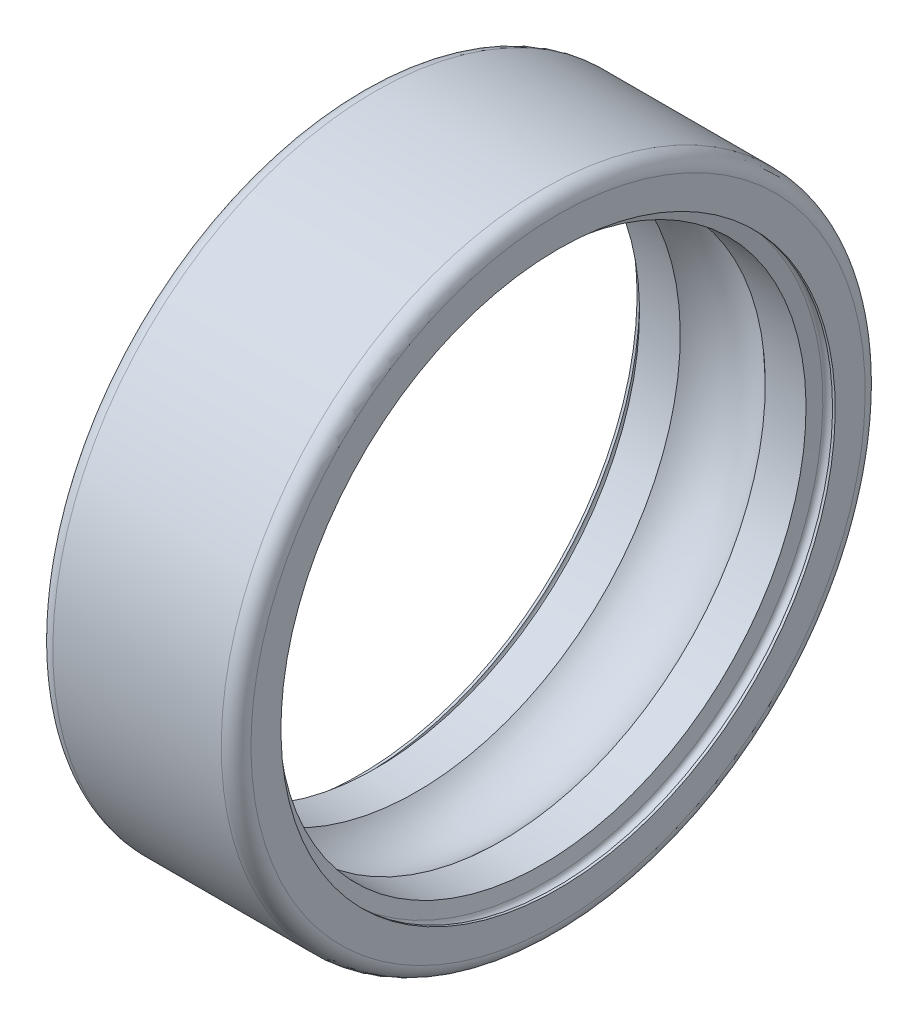
ISO-10303-21;
HEADER;
FILE_DESCRIPTION(('STEP AP214'),'2;1');
FILE_NAME('part.step','',(''),(''),'','','');
FILE_SCHEMA(('AUTOMOTIVE_DESIGN { 1 0 10303 214 1 1 1 1 }'));
ENDSEC;
DATA;
#1=APPLICATION_CONTEXT('core data for automotive mechanical design processes');
#2=APPLICATION_PROTOCOL_DEFINITION('international standard','automotive_design',2000,#1);
#3=PRODUCT_CONTEXT('',#1,'mechanical');
#4=PRODUCT('Part','Part','',(#3));
#5=PRODUCT_RELATED_PRODUCT_CATEGORY('part','',(#4));
#6=PRODUCT_DEFINITION_FORMATION('','',#4);
#7=PRODUCT_DEFINITION_CONTEXT('part definition',#1,'design');
#8=PRODUCT_DEFINITION('design','',#6,#7);
#9=PRODUCT_DEFINITION_SHAPE('','',#8);
#10=(LENGTH_UNIT() NAMED_UNIT(*) SI_UNIT(.MILLI.,.METRE.));
#11=(NAMED_UNIT(*) PLANE_ANGLE_UNIT() SI_UNIT($,.RADIAN.));
#12=(NAMED_UNIT(*) SI_UNIT($,.STERADIAN.) SOLID_ANGLE_UNIT());
#13=UNCERTAINTY_MEASURE_WITH_UNIT(LENGTH_MEASURE(1.E-05),#10,'distance_accuracy_value','');
#14=(GEOMETRIC_REPRESENTATION_CONTEXT(3) GLOBAL_UNCERTAINTY_ASSIGNED_CONTEXT((#13)) GLOBAL_UNIT_ASSIGNED_CONTEXT((#10,
#11,#12)) REPRESENTATION_CONTEXT('',''));
#15=CARTESIAN_POINT('',(0.,0.,0.));
#16=DIRECTION('',(0.,0.,1.));
#17=DIRECTION('',(1.,0.,0.));
#18=AXIS2_PLACEMENT_3D('',#15,#16,#17);
#19=CARTESIAN_POINT('',(7.676,0.,0.));
#20=DIRECTION('',(1.,0.,0.));
#21=DIRECTION('',(0.,0.,-1.));
#22=AXIS2_PLACEMENT_3D('',#19,#20,#21);
#23=TOROIDAL_SURFACE('',#22,11.19,0.216);
#24=CARTESIAN_POINT('',(7.892,0.,0.));
#25=DIRECTION('',(1.,0.,0.));
#26=DIRECTION('',(0.,1.,0.));
#27=AXIS2_PLACEMENT_3D('',#24,#25,#26);
#28=CIRCLE('',#27,11.19);
#29=CARTESIAN_POINT('',(7.892,11.19,0.));
#30=VERTEX_POINT('',#29);
#31=EDGE_CURVE('E11',#30,#30,#28,.T.);
#32=ORIENTED_EDGE('',*,*,#31,.T.);
#33=EDGE_LOOP('',(#32));
#34=FACE_BOUND('',#33,.T.);
#35=CARTESIAN_POINT('',(7.46328152534936,0.,0.));
#36=DIRECTION('',(1.,0.,0.));
#37=DIRECTION('',(0.,1.,0.));
#38=AXIS2_PLACEMENT_3D('',#35,#36,#37);
#39=CIRCLE('',#38,11.2275080063761);
#40=CARTESIAN_POINT('',(7.46328152534936,11.2275080063761,0.));
#41=VERTEX_POINT('',#40);
#42=EDGE_CURVE('E70',#41,#41,#39,.T.);
#43=ORIENTED_EDGE('',*,*,#42,.F.);
#44=EDGE_LOOP('',(#43));
#45=FACE_BOUND('',#44,.T.);
#46=ADVANCED_FACE('F16',(#34,#45),#23,.F.);
#47=CARTESIAN_POINT('',(7.946,0.,0.));
#48=DIRECTION('',(-1.,0.,0.));
#49=DIRECTION('',(0.,1.,0.));
#50=AXIS2_PLACEMENT_3D('',#47,#48,#49);
#51=CYLINDRICAL_SURFACE('',#50,11.19);
#52=CARTESIAN_POINT('',(8.,0.,0.));
#53=DIRECTION('',(1.,0.,0.));
#54=DIRECTION('',(0.,1.,0.));
#55=AXIS2_PLACEMENT_3D('',#52,#53,#54);
#56=CIRCLE('',#55,11.19);
#57=CARTESIAN_POINT('',(8.,11.19,0.));
#58=VERTEX_POINT('',#57);
#59=EDGE_CURVE('E25',#58,#58,#56,.T.);
#60=ORIENTED_EDGE('',*,*,#59,.T.);
#61=EDGE_LOOP('',(#60));
#62=FACE_BOUND('',#61,.T.);
#63=ORIENTED_EDGE('',*,*,#31,.F.);
#64=EDGE_LOOP('',(#63));
#65=FACE_BOUND('',#64,.T.);
#66=ADVANCED_FACE('F120',(#62,#65),#51,.F.);
#67=CARTESIAN_POINT('',(8.,11.795,0.));
#68=DIRECTION('',(1.,0.,0.));
#69=DIRECTION('',(0.,1.,0.));
#70=AXIS2_PLACEMENT_3D('',#67,#68,#69);
#71=PLANE('',#70);
#72=CARTESIAN_POINT('',(8.,0.,0.));
#73=DIRECTION('',(1.,0.,0.));
#74=DIRECTION('',(0.,1.,0.));
#75=AXIS2_PLACEMENT_3D('',#72,#73,#74);
#76=CIRCLE('',#75,12.4);
#77=CARTESIAN_POINT('',(8.,12.4,0.));
#78=VERTEX_POINT('',#77);
#79=EDGE_CURVE('E77',#78,#78,#76,.T.);
#80=ORIENTED_EDGE('',*,*,#79,.T.);
#81=EDGE_LOOP('',(#80));
#82=FACE_BOUND('',#81,.T.);
#83=ORIENTED_EDGE('',*,*,#59,.F.);
#84=EDGE_LOOP('',(#83));
#85=FACE_BOUND('',#84,.T.);
#86=ADVANCED_FACE('F124',(#82,#85),#71,.T.);
#87=CARTESIAN_POINT('',(7.4,0.,0.));
#88=DIRECTION('',(1.,0.,0.));
#89=DIRECTION('',(0.,0.,-1.));
#90=AXIS2_PLACEMENT_3D('',#87,#88,#89);
#91=TOROIDAL_SURFACE('',#90,12.4,0.6);
#92=CARTESIAN_POINT('',(7.4,0.,0.));
#93=DIRECTION('',(1.,0.,0.));
#94=DIRECTION('',(0.,1.,0.));
#95=AXIS2_PLACEMENT_3D('',#92,#93,#94);
#96=CIRCLE('',#95,13.);
#97=CARTESIAN_POINT('',(7.4,13.,0.));
#98=VERTEX_POINT('',#97);
#99=EDGE_CURVE('E78',#98,#98,#96,.T.);
#100=ORIENTED_EDGE('',*,*,#99,.T.);
#101=EDGE_LOOP('',(#100));
#102=FACE_BOUND('',#101,.T.);
#103=ORIENTED_EDGE('',*,*,#79,.F.);
#104=EDGE_LOOP('',(#103));
#105=FACE_BOUND('',#104,.T.);
#106=ADVANCED_FACE('F146',(#102,#105),#91,.T.);
#107=CARTESIAN_POINT('',(4.,0.,0.));
#108=DIRECTION('',(-1.,0.,0.));
#109=DIRECTION('',(0.,1.,0.));
#110=AXIS2_PLACEMENT_3D('',#107,#108,#109);
#111=CYLINDRICAL_SURFACE('',#110,13.);
#112=CARTESIAN_POINT('',(0.6,0.,0.));
#113=DIRECTION('',(1.,0.,0.));
#114=DIRECTION('',(0.,1.,0.));
#115=AXIS2_PLACEMENT_3D('',#112,#113,#114);
#116=CIRCLE('',#115,13.);
#117=CARTESIAN_POINT('',(0.6,13.,0.));
#118=VERTEX_POINT('',#117);
#119=EDGE_CURVE('E82',#118,#118,#116,.T.);
#120=ORIENTED_EDGE('',*,*,#119,.T.);
#121=EDGE_LOOP('',(#120));
#122=FACE_BOUND('',#121,.T.);
#123=ORIENTED_EDGE('',*,*,#99,.F.);
#124=EDGE_LOOP('',(#123));
#125=FACE_BOUND('',#124,.T.);
#126=ADVANCED_FACE('F147',(#122,#125),#111,.T.);
#127=CARTESIAN_POINT('',(0.6,0.,0.));
#128=DIRECTION('',(1.,0.,0.));
#129=DIRECTION('',(0.,0.,-1.));
#130=AXIS2_PLACEMENT_3D('',#127,#128,#129);
#131=TOROIDAL_SURFACE('',#130,12.4,0.6);
#132=CARTESIAN_POINT('',(0.,0.,0.));
#133=DIRECTION('',(1.,0.,0.));
#134=DIRECTION('',(0.,1.,0.));
#135=AXIS2_PLACEMENT_3D('',#132,#133,#134);
#136=CIRCLE('',#135,12.4);
#137=CARTESIAN_POINT('',(0.,12.4,0.));
#138=VERTEX_POINT('',#137);
#139=EDGE_CURVE('E87',#138,#138,#136,.T.);
#140=ORIENTED_EDGE('',*,*,#139,.T.);
#141=EDGE_LOOP('',(#140));
#142=FACE_BOUND('',#141,.T.);
#143=ORIENTED_EDGE('',*,*,#119,.F.);
#144=EDGE_LOOP('',(#143));
#145=FACE_BOUND('',#144,.T.);
#146=ADVANCED_FACE('F142',(#142,#145),#131,.T.);
#147=CARTESIAN_POINT('',(0.,11.795,0.));
#148=DIRECTION('',(-1.,0.,0.));
#149=DIRECTION('',(0.,-1.,0.));
#150=AXIS2_PLACEMENT_3D('',#147,#148,#149);
#151=PLANE('',#150);
#152=CARTESIAN_POINT('',(0.,0.,0.));
#153=DIRECTION('',(1.,0.,0.));
#154=DIRECTION('',(0.,1.,0.));
#155=AXIS2_PLACEMENT_3D('',#152,#153,#154);
#156=CIRCLE('',#155,11.19);
#157=CARTESIAN_POINT('',(0.,11.19,0.));
#158=VERTEX_POINT('',#157);
#159=EDGE_CURVE('E19',#158,#158,#156,.T.);
#160=ORIENTED_EDGE('',*,*,#159,.T.);
#161=EDGE_LOOP('',(#160));
#162=FACE_BOUND('',#161,.T.);
#163=ORIENTED_EDGE('',*,*,#139,.F.);
#164=EDGE_LOOP('',(#163));
#165=FACE_BOUND('',#164,.T.);
#166=ADVANCED_FACE('F139',(#162,#165),#151,.T.);
#167=CARTESIAN_POINT('',(0.054,0.,0.));
#168=DIRECTION('',(-1.,0.,0.));
#169=DIRECTION('',(0.,1.,0.));
#170=AXIS2_PLACEMENT_3D('',#167,#168,#169);
#171=CYLINDRICAL_SURFACE('',#170,11.19);
#172=CARTESIAN_POINT('',(0.108,0.,0.));
#173=DIRECTION('',(1.,0.,0.));
#174=DIRECTION('',(0.,1.,0.));
#175=AXIS2_PLACEMENT_3D('',#172,#173,#174);
#176=CIRCLE('',#175,11.19);
#177=CARTESIAN_POINT('',(0.108,11.19,0.));
#178=VERTEX_POINT('',#177);
#179=EDGE_CURVE('E98',#178,#178,#176,.T.);
#180=ORIENTED_EDGE('',*,*,#179,.T.);
#181=EDGE_LOOP('',(#180));
#182=FACE_BOUND('',#181,.T.);
#183=ORIENTED_EDGE('',*,*,#159,.F.);
#184=EDGE_LOOP('',(#183));
#185=FACE_BOUND('',#184,.T.);
#186=ADVANCED_FACE('F137',(#182,#185),#171,.F.);
#187=CARTESIAN_POINT('',(0.324,0.,0.));
#188=DIRECTION('',(1.,0.,0.));
#189=DIRECTION('',(0.,0.,-1.));
#190=AXIS2_PLACEMENT_3D('',#187,#188,#189);
#191=TOROIDAL_SURFACE('',#190,11.19,0.216);
#192=CARTESIAN_POINT('',(0.536718474650637,0.,0.));
#193=DIRECTION('',(1.,0.,0.));
#194=DIRECTION('',(0.,1.,0.));
#195=AXIS2_PLACEMENT_3D('',#192,#193,#194);
#196=CIRCLE('',#195,11.2275080063761);
#197=CARTESIAN_POINT('',(0.536718474650636,11.2275080063761,0.));
#198=VERTEX_POINT('',#197);
#199=EDGE_CURVE('E89',#198,#198,#196,.T.);
#200=ORIENTED_EDGE('',*,*,#199,.T.);
#201=EDGE_LOOP('',(#200));
#202=FACE_BOUND('',#201,.T.);
#203=ORIENTED_EDGE('',*,*,#179,.F.);
#204=EDGE_LOOP('',(#203));
#205=FACE_BOUND('',#204,.T.);
#206=ADVANCED_FACE('F134',(#202,#205),#191,.F.);
#207=CARTESIAN_POINT('',(0.587633596200264,0.,0.));
#208=DIRECTION('',(-1.,0.,0.));
#209=DIRECTION('',(0.,1.,0.));
#210=AXIS2_PLACEMENT_3D('',#207,#208,#209);
#211=CONICAL_SURFACE('',#210,10.938754003188,1.39626340159546);
#212=CARTESIAN_POINT('',(0.638548717749891,0.,0.));
#213=DIRECTION('',(1.,0.,0.));
#214=DIRECTION('',(0.,1.,0.));
#215=AXIS2_PLACEMENT_3D('',#212,#213,#214);
#216=CIRCLE('',#215,10.65);
#217=CARTESIAN_POINT('',(0.638548717749891,10.65,0.));
#218=VERTEX_POINT('',#217);
#219=EDGE_CURVE('E95',#218,#218,#216,.T.);
#220=ORIENTED_EDGE('',*,*,#219,.T.);
#221=EDGE_LOOP('',(#220));
#222=FACE_BOUND('',#221,.T.);
#223=ORIENTED_EDGE('',*,*,#199,.F.);
#224=EDGE_LOOP('',(#223));
#225=FACE_BOUND('',#224,.T.);
#226=ADVANCED_FACE('F115',(#222,#225),#211,.F.);
#227=CARTESIAN_POINT('',(1.46098230485137,0.,0.));
#228=DIRECTION('',(-1.,0.,0.));
#229=DIRECTION('',(0.,1.,0.));
#230=AXIS2_PLACEMENT_3D('',#227,#228,#229);
#231=CYLINDRICAL_SURFACE('',#230,10.65);
#232=CARTESIAN_POINT('',(2.28341589195286,0.,0.));
#233=DIRECTION('',(1.,0.,0.));
#234=DIRECTION('',(0.,1.,0.));
#235=AXIS2_PLACEMENT_3D('',#232,#233,#234);
#236=CIRCLE('',#235,10.65);
#237=CARTESIAN_POINT('',(2.28341589195286,10.65,0.));
#238=VERTEX_POINT('',#237);
#239=EDGE_CURVE('E75',#238,#238,#236,.T.);
#240=ORIENTED_EDGE('',*,*,#239,.T.);
#241=EDGE_LOOP('',(#240));
#242=FACE_BOUND('',#241,.T.);
#243=ORIENTED_EDGE('',*,*,#219,.F.);
#244=EDGE_LOOP('',(#243));
#245=FACE_BOUND('',#244,.T.);
#246=ADVANCED_FACE('F101',(#242,#245),#231,.F.);
#247=CARTESIAN_POINT('',(4.,0.,0.));
#248=DIRECTION('',(1.,0.,0.));
#249=DIRECTION('',(0.,0.,-1.));
#250=AXIS2_PLACEMENT_3D('',#247,#248,#249);
#251=TOROIDAL_SURFACE('',#250,9.,2.381);
#252=CARTESIAN_POINT('',(5.71658410804714,0.,0.));
#253=DIRECTION('',(1.,0.,0.));
#254=DIRECTION('',(0.,1.,0.));
#255=AXIS2_PLACEMENT_3D('',#252,#253,#254);
#256=CIRCLE('',#255,10.65);
#257=CARTESIAN_POINT('',(5.71658410804714,10.65,0.));
#258=VERTEX_POINT('',#257);
#259=EDGE_CURVE('E72',#258,#258,#256,.T.);
#260=ORIENTED_EDGE('',*,*,#259,.T.);
#261=EDGE_LOOP('',(#260));
#262=FACE_BOUND('',#261,.T.);
#263=ORIENTED_EDGE('',*,*,#239,.F.);
#264=EDGE_LOOP('',(#263));
#265=FACE_BOUND('',#264,.T.);
#266=ADVANCED_FACE('F104',(#262,#265),#251,.F.);
#267=CARTESIAN_POINT('',(6.53901769514863,0.,0.));
#268=DIRECTION('',(-1.,0.,0.));
#269=DIRECTION('',(0.,1.,0.));
#270=AXIS2_PLACEMENT_3D('',#267,#268,#269);
#271=CYLINDRICAL_SURFACE('',#270,10.65);
#272=CARTESIAN_POINT('',(7.36145128225011,0.,0.));
#273=DIRECTION('',(1.,0.,0.));
#274=DIRECTION('',(0.,1.,0.));
#275=AXIS2_PLACEMENT_3D('',#272,#273,#274);
#276=CIRCLE('',#275,10.65);
#277=CARTESIAN_POINT('',(7.36145128225011,10.65,0.));
#278=VERTEX_POINT('',#277);
#279=EDGE_CURVE('E66',#278,#278,#276,.T.);
#280=ORIENTED_EDGE('',*,*,#279,.T.);
#281=EDGE_LOOP('',(#280));
#282=FACE_BOUND('',#281,.T.);
#283=ORIENTED_EDGE('',*,*,#259,.F.);
#284=EDGE_LOOP('',(#283));
#285=FACE_BOUND('',#284,.T.);
#286=ADVANCED_FACE('F67',(#282,#285),#271,.F.);
#287=CARTESIAN_POINT('',(7.41236640379974,0.,0.));
#288=DIRECTION('',(1.,0.,0.));
#289=DIRECTION('',(0.,1.,0.));
#290=AXIS2_PLACEMENT_3D('',#287,#288,#289);
#291=CONICAL_SURFACE('',#290,10.938754003188,1.39626340159547);
#292=ORIENTED_EDGE('',*,*,#42,.T.);
#293=EDGE_LOOP('',(#292));
#294=FACE_BOUND('',#293,.T.);
#295=ORIENTED_EDGE('',*,*,#279,.F.);
#296=EDGE_LOOP('',(#295));
#297=FACE_BOUND('',#296,.T.);
#298=ADVANCED_FACE('F113',(#294,#297),#291,.F.);
#299=CLOSED_SHELL('',(#46,#66,#86,#106,#126,#146,#166,#186,#206,#226,#246,#266,#286,#298));
#300=MANIFOLD_SOLID_BREP('B1',#299);
#301=ADVANCED_BREP_SHAPE_REPRESENTATION('',(#18,#300),#14);
#302=SHAPE_DEFINITION_REPRESENTATION(#9,#301);
ENDSEC;
END-ISO-10303-21;
